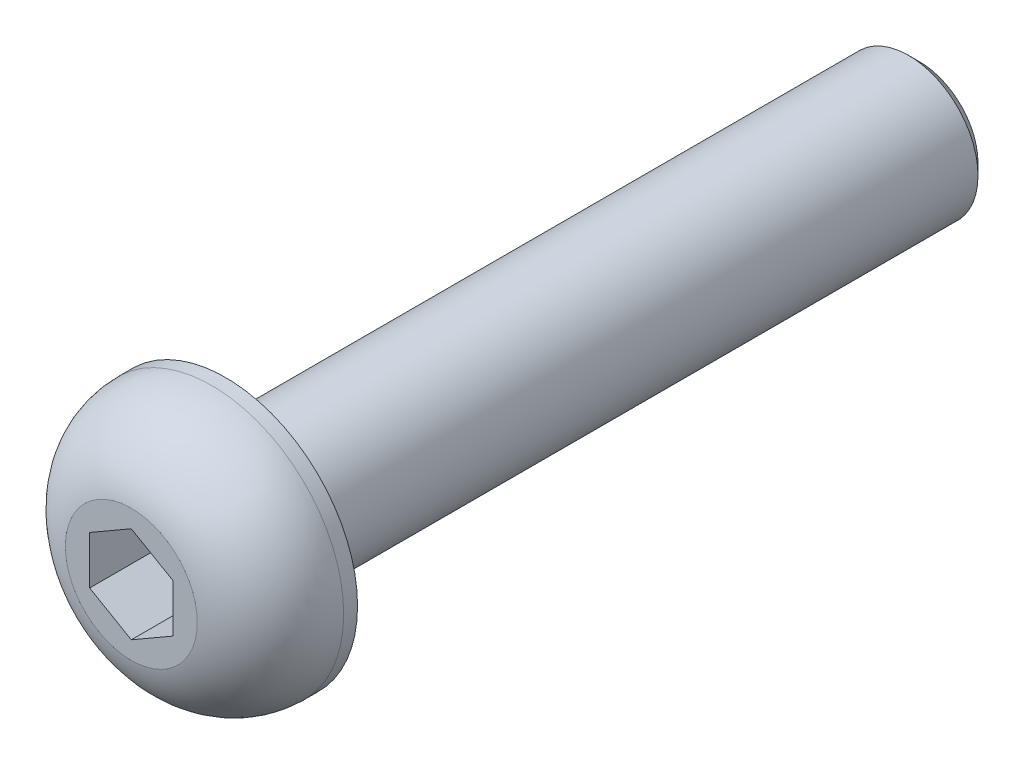
ISO-10303-21;
HEADER;
FILE_DESCRIPTION(('STEP AP214'),'2;1');
FILE_NAME('part.step','',(''),(''),'','','');
FILE_SCHEMA(('AUTOMOTIVE_DESIGN { 1 0 10303 214 1 1 1 1 }'));
ENDSEC;
DATA;
#1=APPLICATION_CONTEXT('core data for automotive mechanical design processes');
#2=APPLICATION_PROTOCOL_DEFINITION('international standard','automotive_design',2000,#1);
#3=PRODUCT_CONTEXT('',#1,'mechanical');
#4=PRODUCT('Part','Part','',(#3));
#5=PRODUCT_RELATED_PRODUCT_CATEGORY('part','',(#4));
#6=PRODUCT_DEFINITION_FORMATION('','',#4);
#7=PRODUCT_DEFINITION_CONTEXT('part definition',#1,'design');
#8=PRODUCT_DEFINITION('design','',#6,#7);
#9=PRODUCT_DEFINITION_SHAPE('','',#8);
#10=(LENGTH_UNIT() NAMED_UNIT(*) SI_UNIT(.MILLI.,.METRE.));
#11=(NAMED_UNIT(*) PLANE_ANGLE_UNIT() SI_UNIT($,.RADIAN.));
#12=(NAMED_UNIT(*) SI_UNIT($,.STERADIAN.) SOLID_ANGLE_UNIT());
#13=UNCERTAINTY_MEASURE_WITH_UNIT(LENGTH_MEASURE(1.E-05),#10,'distance_accuracy_value','');
#14=(GEOMETRIC_REPRESENTATION_CONTEXT(3) GLOBAL_UNCERTAINTY_ASSIGNED_CONTEXT((#13)) GLOBAL_UNIT_ASSIGNED_CONTEXT((#10,
#11,#12)) REPRESENTATION_CONTEXT('',''));
#15=CARTESIAN_POINT('',(0.,0.,0.));
#16=DIRECTION('',(0.,0.,1.));
#17=DIRECTION('',(1.,0.,0.));
#18=AXIS2_PLACEMENT_3D('',#15,#16,#17);
#19=CARTESIAN_POINT('',(0.,2.375,3.4));
#20=DIRECTION('',(0.,0.,-1.));
#21=DIRECTION('',(-1.,0.,0.));
#22=AXIS2_PLACEMENT_3D('',#19,#20,#21);
#23=PLANE('',#22);
#24=CARTESIAN_POINT('',(0.,0.,3.4));
#25=DIRECTION('',(0.,0.,1.));
#26=DIRECTION('',(1.,0.,0.));
#27=AXIS2_PLACEMENT_3D('',#24,#25,#26);
#28=CIRCLE('',#27,2.375);
#29=CARTESIAN_POINT('',(2.375,0.,3.4));
#30=VERTEX_POINT('',#29);
#31=EDGE_CURVE('E140',#30,#30,#28,.T.);
#32=ORIENTED_EDGE('',*,*,#31,.T.);
#33=EDGE_LOOP('',(#32));
#34=FACE_BOUND('',#33,.T.);
#35=DIRECTION('',(-0.866025403784439,-0.5,0.));
#36=VECTOR('',#35,1.);
#37=CARTESIAN_POINT('',(0.,1.73205080756888,3.4));
#38=LINE('',#37,#36);
#39=CARTESIAN_POINT('',(0.,1.73205080756888,3.4));
#40=VERTEX_POINT('',#39);
#41=CARTESIAN_POINT('',(-1.5,0.866025403784438,3.4));
#42=VERTEX_POINT('',#41);
#43=EDGE_CURVE('E92',#40,#42,#38,.T.);
#44=ORIENTED_EDGE('',*,*,#43,.F.);
#45=DIRECTION('',(-0.866025403784439,0.5,0.));
#46=VECTOR('',#45,1.);
#47=CARTESIAN_POINT('',(1.5,0.866025403784439,3.4));
#48=LINE('',#47,#46);
#49=CARTESIAN_POINT('',(1.5,0.866025403784439,3.4));
#50=VERTEX_POINT('',#49);
#51=EDGE_CURVE('E52',#50,#40,#48,.T.);
#52=ORIENTED_EDGE('',*,*,#51,.F.);
#53=DIRECTION('',(0.,1.,0.));
#54=VECTOR('',#53,1.);
#55=CARTESIAN_POINT('',(1.5,-0.866025403784438,3.4));
#56=LINE('',#55,#54);
#57=CARTESIAN_POINT('',(1.5,-0.866025403784438,3.4));
#58=VERTEX_POINT('',#57);
#59=EDGE_CURVE('E120',#58,#50,#56,.T.);
#60=ORIENTED_EDGE('',*,*,#59,.F.);
#61=DIRECTION('',(0.866025403784438,0.5,0.));
#62=VECTOR('',#61,1.);
#63=CARTESIAN_POINT('',(0.,-1.73205080756888,3.4));
#64=LINE('',#63,#62);
#65=CARTESIAN_POINT('',(0.,-1.73205080756888,3.4));
#66=VERTEX_POINT('',#65);
#67=EDGE_CURVE('E114',#66,#58,#64,.T.);
#68=ORIENTED_EDGE('',*,*,#67,.F.);
#69=DIRECTION('',(0.866025403784439,-0.5,0.));
#70=VECTOR('',#69,1.);
#71=CARTESIAN_POINT('',(-1.5,-0.866025403784438,3.4));
#72=LINE('',#71,#70);
#73=CARTESIAN_POINT('',(-1.5,-0.866025403784438,3.4));
#74=VERTEX_POINT('',#73);
#75=EDGE_CURVE('E112',#74,#66,#72,.T.);
#76=ORIENTED_EDGE('',*,*,#75,.F.);
#77=DIRECTION('',(0.,-1.,0.));
#78=VECTOR('',#77,1.);
#79=CARTESIAN_POINT('',(-1.5,0.866025403784438,3.4));
#80=LINE('',#79,#78);
#81=EDGE_CURVE('E100',#42,#74,#80,.T.);
#82=ORIENTED_EDGE('',*,*,#81,.F.);
#83=EDGE_LOOP('',(#44,#52,#60,#68,#76,#82));
#84=FACE_BOUND('',#83,.T.);
#85=ADVANCED_FACE('F37',(#34,#84),#23,.F.);
#86=CARTESIAN_POINT('',(0.,0.,-25.));
#87=DIRECTION('',(0.,0.,1.));
#88=DIRECTION('',(1.,0.,0.));
#89=AXIS2_PLACEMENT_3D('',#86,#87,#88);
#90=PLANE('',#89);
#91=CARTESIAN_POINT('',(0.,0.,-25.));
#92=DIRECTION('',(0.,0.,1.));
#93=DIRECTION('',(1.,0.,0.));
#94=AXIS2_PLACEMENT_3D('',#91,#92,#93);
#95=CIRCLE('',#94,2.09999999999999);
#96=CARTESIAN_POINT('',(2.09999999999999,0.,-25.));
#97=VERTEX_POINT('',#96);
#98=EDGE_CURVE('E231',#97,#97,#95,.F.);
#99=ORIENTED_EDGE('',*,*,#98,.T.);
#100=EDGE_LOOP('',(#99));
#101=FACE_BOUND('',#100,.T.);
#102=ADVANCED_FACE('F209',(#101),#90,.F.);
#103=CARTESIAN_POINT('',(0.,0.,30.8099697885196));
#104=DIRECTION('',(0.,0.,1.));
#105=DIRECTION('',(1.,0.,0.));
#106=AXIS2_PLACEMENT_3D('',#103,#104,#105);
#107=CYLINDRICAL_SURFACE('',#106,2.5);
#108=CARTESIAN_POINT('',(0.,0.,-0.199999999999999));
#109=DIRECTION('',(0.,0.,1.));
#110=DIRECTION('',(1.,0.,0.));
#111=AXIS2_PLACEMENT_3D('',#108,#109,#110);
#112=CIRCLE('',#111,2.5);
#113=CARTESIAN_POINT('',(2.5,0.,-0.199999999999999));
#114=VERTEX_POINT('',#113);
#115=EDGE_CURVE('E11',#114,#114,#112,.F.);
#116=ORIENTED_EDGE('',*,*,#115,.T.);
#117=EDGE_LOOP('',(#116));
#118=FACE_BOUND('',#117,.T.);
#119=CARTESIAN_POINT('',(0.,0.,-24.6));
#120=DIRECTION('',(0.,0.,1.));
#121=DIRECTION('',(1.,0.,0.));
#122=AXIS2_PLACEMENT_3D('',#119,#120,#121);
#123=CIRCLE('',#122,2.5);
#124=CARTESIAN_POINT('',(2.5,0.,-24.6));
#125=VERTEX_POINT('',#124);
#126=EDGE_CURVE('E226',#125,#125,#123,.T.);
#127=ORIENTED_EDGE('',*,*,#126,.T.);
#128=EDGE_LOOP('',(#127));
#129=FACE_BOUND('',#128,.T.);
#130=ADVANCED_FACE('F214',(#118,#129),#107,.T.);
#131=CARTESIAN_POINT('',(0.,2.5,0.));
#132=DIRECTION('',(0.,0.,1.));
#133=DIRECTION('',(1.,0.,0.));
#134=AXIS2_PLACEMENT_3D('',#131,#132,#133);
#135=PLANE('',#134);
#136=CARTESIAN_POINT('',(0.,0.,0.));
#137=DIRECTION('',(0.,0.,1.));
#138=DIRECTION('',(1.,0.,0.));
#139=AXIS2_PLACEMENT_3D('',#136,#137,#138);
#140=CIRCLE('',#139,2.7);
#141=CARTESIAN_POINT('',(2.7,0.,0.));
#142=VERTEX_POINT('',#141);
#143=EDGE_CURVE('E45',#142,#142,#140,.T.);
#144=ORIENTED_EDGE('',*,*,#143,.T.);
#145=EDGE_LOOP('',(#144));
#146=FACE_BOUND('',#145,.T.);
#147=CARTESIAN_POINT('',(0.,0.,0.));
#148=DIRECTION('',(0.,0.,1.));
#149=DIRECTION('',(1.,0.,0.));
#150=AXIS2_PLACEMENT_3D('',#147,#148,#149);
#151=CIRCLE('',#150,4.75);
#152=CARTESIAN_POINT('',(4.75,0.,0.));
#153=VERTEX_POINT('',#152);
#154=EDGE_CURVE('E222',#153,#153,#151,.T.);
#155=ORIENTED_EDGE('',*,*,#154,.F.);
#156=EDGE_LOOP('',(#155));
#157=FACE_BOUND('',#156,.T.);
#158=ADVANCED_FACE('F236',(#146,#157),#135,.F.);
#159=CARTESIAN_POINT('',(0.,0.,30.8099697885196));
#160=DIRECTION('',(0.,0.,1.));
#161=DIRECTION('',(1.,0.,0.));
#162=AXIS2_PLACEMENT_3D('',#159,#160,#161);
#163=CYLINDRICAL_SURFACE('',#162,4.75);
#164=CARTESIAN_POINT('',(0.,0.,0.5));
#165=DIRECTION('',(0.,0.,1.));
#166=DIRECTION('',(1.,0.,0.));
#167=AXIS2_PLACEMENT_3D('',#164,#165,#166);
#168=CIRCLE('',#167,4.75);
#169=CARTESIAN_POINT('',(4.75,0.,0.5));
#170=VERTEX_POINT('',#169);
#171=EDGE_CURVE('E220',#170,#170,#168,.T.);
#172=ORIENTED_EDGE('',*,*,#171,.F.);
#173=EDGE_LOOP('',(#172));
#174=FACE_BOUND('',#173,.T.);
#175=ORIENTED_EDGE('',*,*,#154,.T.);
#176=EDGE_LOOP('',(#175));
#177=FACE_BOUND('',#176,.T.);
#178=ADVANCED_FACE('F258',(#174,#177),#163,.T.);
#179=CARTESIAN_POINT('',(0.,0.,0.499999999999999));
#180=DIRECTION('',(0.,0.,1.));
#181=DIRECTION('',(1.,0.,0.));
#182=AXIS2_PLACEMENT_3D('',#179,#180,#181);
#183=DEGENERATE_TOROIDAL_SURFACE('',#182,1.79197368421052,2.95802631578948,.T.);
#184=ORIENTED_EDGE('',*,*,#31,.F.);
#185=EDGE_LOOP('',(#184));
#186=FACE_BOUND('',#185,.T.);
#187=ORIENTED_EDGE('',*,*,#171,.T.);
#188=EDGE_LOOP('',(#187));
#189=FACE_BOUND('',#188,.T.);
#190=ADVANCED_FACE('F252',(#186,#189),#183,.T.);
#191=CARTESIAN_POINT('',(0.,0.,-24.6));
#192=DIRECTION('',(0.,0.,1.));
#193=DIRECTION('',(1.,0.,0.));
#194=AXIS2_PLACEMENT_3D('',#191,#192,#193);
#195=CONICAL_SURFACE('',#194,2.5,0.785398163397445);
#196=ORIENTED_EDGE('',*,*,#98,.F.);
#197=EDGE_LOOP('',(#196));
#198=FACE_BOUND('',#197,.T.);
#199=ORIENTED_EDGE('',*,*,#126,.F.);
#200=EDGE_LOOP('',(#199));
#201=FACE_BOUND('',#200,.T.);
#202=ADVANCED_FACE('F250',(#198,#201),#195,.T.);
#203=CARTESIAN_POINT('',(1.5,0.866025403784439,-25.001));
#204=DIRECTION('',(0.5,0.866025403784439,0.));
#205=DIRECTION('',(-0.866025403784439,0.5,0.));
#206=AXIS2_PLACEMENT_3D('',#203,#204,#205);
#207=PLANE('',#206);
#208=CARTESIAN_POINT('',(-0.000199999999999678,1.73216627762271,1.13404126954845));
#209=CARTESIAN_POINT('',(0.0657192911025481,1.69410775715987,1.11205745276918));
#210=CARTESIAN_POINT('',(0.132207589122236,1.65572072040024,1.09206348568182));
#211=CARTESIAN_POINT('',(0.266335660665071,1.5782818421891,1.05716269718451));
#212=CARTESIAN_POINT('',(0.333977818646887,1.53922862406973,1.04226822432317));
#213=CARTESIAN_POINT('',(0.468423777869844,1.4616062133209,1.01908127731024));
#214=CARTESIAN_POINT('',(0.535206884927249,1.42304896848399,1.01063450771181));
#215=CARTESIAN_POINT('',(0.669087568389882,1.34575291984755,1.00054817351185));
#216=CARTESIAN_POINT('',(0.73618465770438,1.30701439726998,0.998900259357891));
#217=CARTESIAN_POINT('',(0.861574731829197,1.23462040422031,1.0023162190531));
#218=CARTESIAN_POINT('',(0.919886423219821,1.20095413349903,1.00654135522398));
#219=CARTESIAN_POINT('',(1.03612987953878,1.13384094270175,1.01993637143267));
#220=CARTESIAN_POINT('',(1.09406124196879,1.10039425500826,1.02911083361585));
#221=CARTESIAN_POINT('',(1.21054465133915,1.03314252725216,1.052047779955));
#222=CARTESIAN_POINT('',(1.26908194454669,0.999346005261151,1.06590755816145));
#223=CARTESIAN_POINT('',(1.38528312338636,0.932257223377917,1.09736438023666));
#224=CARTESIAN_POINT('',(1.44294849940381,0.898964103011321,1.11495402588962));
#225=CARTESIAN_POINT('',(1.5002,0.865909933730601,1.13404126954845));
#226=B_SPLINE_CURVE_WITH_KNOTS('',3,(#208,#209,#210,#211,#212,#213,#214,#215,#216,#217,#218,
#219,#220,#221,#222,#223,#224,#225),.UNSPECIFIED.,.F.,.F.,(4,2,2,2,2,2,2,2,4),(0.,
0.237777822177384,0.47612742284192,0.708577067230591,0.940741159251582,1.14294352835891,
1.34533342091876,1.55221450553907,1.75868901573748),.UNSPECIFIED.);
#227=CARTESIAN_POINT('',(0.,1.73205080756888,1.13397459621556));
#228=VERTEX_POINT('',#227);
#229=CARTESIAN_POINT('',(1.5,0.86602540378444,1.13397459621556));
#230=VERTEX_POINT('',#229);
#231=EDGE_CURVE('E141',#228,#230,#226,.T.);
#232=ORIENTED_EDGE('',*,*,#231,.T.);
#233=DIRECTION('',(0.,0.,1.));
#234=VECTOR('',#233,1.);
#235=CARTESIAN_POINT('',(1.5,0.866025403784439,-25.001));
#236=LINE('',#235,#234);
#237=EDGE_CURVE('E122',#230,#50,#236,.T.);
#238=ORIENTED_EDGE('',*,*,#237,.T.);
#239=ORIENTED_EDGE('',*,*,#51,.T.);
#240=DIRECTION('',(0.,0.,1.));
#241=VECTOR('',#240,1.);
#242=CARTESIAN_POINT('',(0.,1.73205080756888,-25.001));
#243=LINE('',#242,#241);
#244=EDGE_CURVE('E97',#228,#40,#243,.T.);
#245=ORIENTED_EDGE('',*,*,#244,.F.);
#246=EDGE_LOOP('',(#232,#238,#239,#245));
#247=FACE_BOUND('',#246,.T.);
#248=ADVANCED_FACE('F151',(#247),#207,.F.);
#249=CARTESIAN_POINT('',(1.5,-0.866025403784438,-25.001));
#250=DIRECTION('',(1.,0.,0.));
#251=DIRECTION('',(0.,1.,0.));
#252=AXIS2_PLACEMENT_3D('',#249,#250,#251);
#253=PLANE('',#252);
#254=CARTESIAN_POINT('',(1.5,-2.37874877868409,1.75759665323203));
#255=CARTESIAN_POINT('',(1.5,-2.31274574502044,1.72537160492485));
#256=CARTESIAN_POINT('',(1.5,-2.24659666013007,1.69344083131604));
#257=CARTESIAN_POINT('',(1.5,-2.11392884782338,1.63033245608343));
#258=CARTESIAN_POINT('',(1.5,-2.04741006838187,1.59915496394457));
#259=CARTESIAN_POINT('',(1.5,-1.91360751694505,1.53757215136867));
#260=CARTESIAN_POINT('',(1.5,-1.84632157835343,1.50717152292928));
#261=CARTESIAN_POINT('',(1.5,-1.71123224774828,1.44754705704895));
#262=CARTESIAN_POINT('',(1.5,-1.64342887898006,1.41832316710951));
#263=CARTESIAN_POINT('',(1.5,-1.50487114211733,1.36038888038743));
#264=CARTESIAN_POINT('',(1.5,-1.43409507585528,1.33173010789239));
#265=CARTESIAN_POINT('',(1.5,-1.2917483015657,1.27646281245522));
#266=CARTESIAN_POINT('',(1.5,-1.22017766117702,1.2498541165065));
#267=CARTESIAN_POINT('',(1.5,-1.07622501054223,1.19933823991993));
#268=CARTESIAN_POINT('',(1.5,-1.00384469305776,1.17542628177461));
#269=CARTESIAN_POINT('',(1.5,-0.858047452698781,1.13103890364063));
#270=CARTESIAN_POINT('',(1.5,-0.784630847150789,1.11056245537912));
#271=CARTESIAN_POINT('',(1.5,-0.637106765977147,1.0740972559044));
#272=CARTESIAN_POINT('',(1.5,-0.563005435987777,1.05808408778549));
#273=CARTESIAN_POINT('',(1.5,-0.413830143693647,1.03142192462866));
#274=CARTESIAN_POINT('',(1.5,-0.33875630129043,1.02077227465615));
#275=CARTESIAN_POINT('',(1.5,-0.189006040097561,1.00582523758463));
#276=CARTESIAN_POINT('',(1.5,-0.114338404690483,1.0014423232251));
#277=CARTESIAN_POINT('',(1.5,0.035097513669746,0.999161779875737));
#278=CARTESIAN_POINT('',(1.5,0.109865799731961,1.00126435603912));
#279=CARTESIAN_POINT('',(1.5,0.286095689598936,1.01368949202895));
#280=CARTESIAN_POINT('',(1.5,0.387367328373921,1.02672550290978));
#281=CARTESIAN_POINT('',(1.5,0.588195456312349,1.06255311121105));
#282=CARTESIAN_POINT('',(1.5,0.687750028982992,1.08535495747343));
#283=CARTESIAN_POINT('',(1.5,0.836816450941095,1.12531444011054));
#284=CARTESIAN_POINT('',(1.5,0.887073280800136,1.13980777431215));
#285=CARTESIAN_POINT('',(1.5,0.987067327855988,1.17039532179613));
#286=CARTESIAN_POINT('',(1.5,1.03680482900076,1.18648860351975));
#287=CARTESIAN_POINT('',(1.5,1.13582038517206,1.2200193186232));
#288=CARTESIAN_POINT('',(1.5,1.1850984463968,1.23745673384009));
#289=CARTESIAN_POINT('',(1.5,1.28324593886576,1.27346102756484));
#290=CARTESIAN_POINT('',(1.5,1.33211531537388,1.29202805469345));
#291=CARTESIAN_POINT('',(1.5,1.49440566438627,1.35547975652815));
#292=CARTESIAN_POINT('',(1.5,1.60701277223779,1.402445250974));
#293=CARTESIAN_POINT('',(1.5,1.83075302149775,1.49978016475535));
#294=CARTESIAN_POINT('',(1.5,1.94188581099527,1.55015037989139));
#295=CARTESIAN_POINT('',(1.5,2.16311574833764,1.65327366353819));
#296=CARTESIAN_POINT('',(1.5,2.27321224673675,1.70602811986459));
#297=CARTESIAN_POINT('',(1.5,2.49258510502557,1.81321950035594));
#298=CARTESIAN_POINT('',(1.5,2.60186142786115,1.86765649997343));
#299=CARTESIAN_POINT('',(1.5,2.92929969008695,2.03305140834138));
#300=CARTESIAN_POINT('',(1.5,3.14653602298829,2.14583782126264));
#301=CARTESIAN_POINT('',(1.5,3.57945631818397,2.37412943553697));
#302=CARTESIAN_POINT('',(1.5,3.79514084212188,2.48963358117076));
#303=CARTESIAN_POINT('',(1.5,4.19416669408602,2.70541439387798));
#304=CARTESIAN_POINT('',(1.5,4.37763617108744,2.80545434459614));
#305=CARTESIAN_POINT('',(1.5,4.74410282064929,3.00644416922784));
#306=CARTESIAN_POINT('',(1.5,4.92709993621561,3.10739414689505));
#307=CARTESIAN_POINT('',(1.5,5.29191078057049,3.30948937221621));
#308=CARTESIAN_POINT('',(1.5,5.47372612938883,3.41063169806351));
#309=CARTESIAN_POINT('',(1.5,5.83705821615903,3.61339728699118));
#310=CARTESIAN_POINT('',(1.5,6.01857498914784,3.71502048726914));
#311=CARTESIAN_POINT('',(1.5,6.19999510741632,3.81681495532188));
#312=B_SPLINE_CURVE_WITH_KNOTS('',3,(#254,#255,#256,#257,#258,#259,#260,#261,#262,#263,#264,
#265,#266,#267,#268,#269,#270,#271,#272,#273,#274,#275,#276,#277,#278,#279,#280,#281,#282,#283,
#284,#285,#286,#287,#288,#289,#290,#291,#292,#293,#294,#295,#296,#297,#298,#299,#300,#301,#302,
#303,#304,#305,#306,#307,#308,#309,#310,#311),.UNSPECIFIED.,.F.,.F.,(4,2,2,2,2,2,2,2,2,2,2,2,2,
2,2,2,2,2,2,2,2,2,2,2,2,2,2,2,4),(0.,0.220351468140766,0.44073477269315,0.662230491180661,
0.883716316980751,1.11276649608326,1.34179732435009,1.57041580992587,1.79896574579805,
2.02623966904286,2.25348583333163,2.47759997074845,2.70172119756067,3.00742120849379,
3.31344282815401,3.47033697782919,3.62714030606318,3.78394151582572,3.94076340040727,
4.30669011496381,4.67270265694945,5.03893106221478,5.4051759146467,6.13944337782784,
6.87343017182309,7.5003405818442,8.12732339442968,8.75148543497969,9.37556809355048),.UNSPECIFIED.);
#313=CARTESIAN_POINT('',(1.5,-0.866025403784438,1.13397459621556));
#314=VERTEX_POINT('',#313);
#315=EDGE_CURVE('E180',#230,#314,#312,.F.);
#316=ORIENTED_EDGE('',*,*,#315,.T.);
#317=DIRECTION('',(0.,0.,1.));
#318=VECTOR('',#317,1.);
#319=CARTESIAN_POINT('',(1.5,-0.866025403784438,-25.001));
#320=LINE('',#319,#318);
#321=EDGE_CURVE('E124',#314,#58,#320,.T.);
#322=ORIENTED_EDGE('',*,*,#321,.T.);
#323=ORIENTED_EDGE('',*,*,#59,.T.);
#324=ORIENTED_EDGE('',*,*,#237,.F.);
#325=EDGE_LOOP('',(#316,#322,#323,#324));
#326=FACE_BOUND('',#325,.T.);
#327=ADVANCED_FACE('F191',(#326),#253,.F.);
#328=CARTESIAN_POINT('',(0.,-1.73205080756888,-25.001));
#329=DIRECTION('',(0.5,-0.866025403784438,0.));
#330=DIRECTION('',(0.866025403784439,0.5,0.));
#331=AXIS2_PLACEMENT_3D('',#328,#329,#330);
#332=PLANE('',#331);
#333=CARTESIAN_POINT('',(1.5002,-0.8659099337306,1.13404126954845));
#334=CARTESIAN_POINT('',(1.43428070889745,-0.903968454193445,1.11205745276918));
#335=CARTESIAN_POINT('',(1.36779241087776,-0.942355490953072,1.09206348568182));
#336=CARTESIAN_POINT('',(1.23366433933493,-1.01979436916421,1.05716269718451));
#337=CARTESIAN_POINT('',(1.16602218135311,-1.05884758728358,1.04226822432317));
#338=CARTESIAN_POINT('',(1.03157622213016,-1.13646999803241,1.01908127731024));
#339=CARTESIAN_POINT('',(0.964793115072751,-1.17502724286933,1.01063450771181));
#340=CARTESIAN_POINT('',(0.830912431610118,-1.25232329150577,1.00054817351185));
#341=CARTESIAN_POINT('',(0.76381534229562,-1.29106181408333,0.998900259357891));
#342=CARTESIAN_POINT('',(0.638425268170803,-1.363455807133,1.0023162190531));
#343=CARTESIAN_POINT('',(0.580113576780179,-1.39712207785428,1.00654135522398));
#344=CARTESIAN_POINT('',(0.463870120461216,-1.46423526865157,1.01993637143267));
#345=CARTESIAN_POINT('',(0.405938758031214,-1.49768195634505,1.02911083361585));
#346=CARTESIAN_POINT('',(0.289455348660848,-1.56493368410116,1.052047779955));
#347=CARTESIAN_POINT('',(0.230918055453308,-1.59873020609216,1.06590755816145));
#348=CARTESIAN_POINT('',(0.11471687661364,-1.6658189879754,1.09736438023666));
#349=CARTESIAN_POINT('',(0.0570515005961901,-1.69911210834199,1.11495402588962));
#350=CARTESIAN_POINT('',(-0.000199999999999011,-1.73216627762271,1.13404126954845));
#351=B_SPLINE_CURVE_WITH_KNOTS('',3,(#333,#334,#335,#336,#337,#338,#339,#340,#341,#342,#343,
#344,#345,#346,#347,#348,#349,#350),.UNSPECIFIED.,.F.,.F.,(4,2,2,2,2,2,2,2,4),(0.,
0.237777822177384,0.47612742284192,0.708577067230591,0.940741159251582,1.14294352835891,
1.34533342091876,1.55221450553907,1.75868901573748),.UNSPECIFIED.);
#352=CARTESIAN_POINT('',(0.,-1.73205080756888,1.13397459621556));
#353=VERTEX_POINT('',#352);
#354=EDGE_CURVE('E173',#314,#353,#351,.T.);
#355=ORIENTED_EDGE('',*,*,#354,.T.);
#356=DIRECTION('',(0.,0.,1.));
#357=VECTOR('',#356,1.);
#358=CARTESIAN_POINT('',(0.,-1.73205080756888,-25.001));
#359=LINE('',#358,#357);
#360=EDGE_CURVE('E127',#353,#66,#359,.T.);
#361=ORIENTED_EDGE('',*,*,#360,.T.);
#362=ORIENTED_EDGE('',*,*,#67,.T.);
#363=ORIENTED_EDGE('',*,*,#321,.F.);
#364=EDGE_LOOP('',(#355,#361,#362,#363));
#365=FACE_BOUND('',#364,.T.);
#366=ADVANCED_FACE('F194',(#365),#332,.F.);
#367=CARTESIAN_POINT('',(-1.5,-0.866025403784438,-25.001));
#368=DIRECTION('',(-0.5,-0.866025403784439,0.));
#369=DIRECTION('',(0.866025403784439,-0.5,0.));
#370=AXIS2_PLACEMENT_3D('',#367,#368,#369);
#371=PLANE('',#370);
#372=CARTESIAN_POINT('',(0.000200000000000867,-1.73216627762271,1.13404126954845));
#373=CARTESIAN_POINT('',(-0.0657192911025468,-1.69410775715987,1.11205745276918));
#374=CARTESIAN_POINT('',(-0.132207589122234,-1.65572072040024,1.09206348568182));
#375=CARTESIAN_POINT('',(-0.26633566066507,-1.5782818421891,1.05716269718451));
#376=CARTESIAN_POINT('',(-0.333977818646886,-1.53922862406973,1.04226822432317));
#377=CARTESIAN_POINT('',(-0.468423777869843,-1.4616062133209,1.01908127731024));
#378=CARTESIAN_POINT('',(-0.535206884927247,-1.42304896848399,1.01063450771181));
#379=CARTESIAN_POINT('',(-0.66908756838988,-1.34575291984755,1.00054817351185));
#380=CARTESIAN_POINT('',(-0.736184657704379,-1.30701439726998,0.998900259357891));
#381=CARTESIAN_POINT('',(-0.861574731829196,-1.23462040422031,1.0023162190531));
#382=CARTESIAN_POINT('',(-0.91988642321982,-1.20095413349903,1.00654135522398));
#383=CARTESIAN_POINT('',(-1.03612987953878,-1.13384094270175,1.01993637143267));
#384=CARTESIAN_POINT('',(-1.09406124196879,-1.10039425500826,1.02911083361585));
#385=CARTESIAN_POINT('',(-1.21054465133915,-1.03314252725216,1.052047779955));
#386=CARTESIAN_POINT('',(-1.26908194454669,-0.99934600526115,1.06590755816145));
#387=CARTESIAN_POINT('',(-1.38528312338636,-0.932257223377916,1.09736438023666));
#388=CARTESIAN_POINT('',(-1.44294849940381,-0.89896410301132,1.11495402588962));
#389=CARTESIAN_POINT('',(-1.5002,-0.8659099337306,1.13404126954845));
#390=B_SPLINE_CURVE_WITH_KNOTS('',3,(#372,#373,#374,#375,#376,#377,#378,#379,#380,#381,#382,
#383,#384,#385,#386,#387,#388,#389),.UNSPECIFIED.,.F.,.F.,(4,2,2,2,2,2,2,2,4),(0.,
0.237777822177384,0.47612742284192,0.708577067230591,0.940741159251582,1.14294352835891,
1.34533342091876,1.55221450553907,1.75868901573748),.UNSPECIFIED.);
#391=CARTESIAN_POINT('',(-1.5,-0.866025403784476,1.13397459621554));
#392=VERTEX_POINT('',#391);
#393=EDGE_CURVE('E166',#353,#392,#390,.T.);
#394=ORIENTED_EDGE('',*,*,#393,.T.);
#395=DIRECTION('',(0.,0.,1.));
#396=VECTOR('',#395,1.);
#397=CARTESIAN_POINT('',(-1.5,-0.866025403784438,-25.001));
#398=LINE('',#397,#396);
#399=EDGE_CURVE('E108',#392,#74,#398,.T.);
#400=ORIENTED_EDGE('',*,*,#399,.T.);
#401=ORIENTED_EDGE('',*,*,#75,.T.);
#402=ORIENTED_EDGE('',*,*,#360,.F.);
#403=EDGE_LOOP('',(#394,#400,#401,#402));
#404=FACE_BOUND('',#403,.T.);
#405=ADVANCED_FACE('F198',(#404),#371,.F.);
#406=CARTESIAN_POINT('',(-1.5,0.866025403784438,-25.001));
#407=DIRECTION('',(-1.,0.,0.));
#408=DIRECTION('',(0.,0.,1.));
#409=AXIS2_PLACEMENT_3D('',#406,#407,#408);
#410=PLANE('',#409);
#411=CARTESIAN_POINT('',(-1.5,-2.37874877486364,1.75759665136626));
#412=CARTESIAN_POINT('',(-1.5,-2.31274574132915,1.72537160313687));
#413=CARTESIAN_POINT('',(-1.5,-2.24659665656804,1.69344082960579));
#414=CARTESIAN_POINT('',(-1.5,-2.11392884452025,1.63033245452826));
#415=CARTESIAN_POINT('',(-1.5,-2.04741006520838,1.59915496246675));
#416=CARTESIAN_POINT('',(-1.5,-1.91360751403276,1.53757215004554));
#417=CARTESIAN_POINT('',(-1.5,-1.84632157557268,1.5071715216835));
#418=CARTESIAN_POINT('',(-1.5,-1.71123224523151,1.44754705595659));
#419=CARTESIAN_POINT('',(-1.5,-1.64342887659572,1.41832316609321));
#420=CARTESIAN_POINT('',(-1.5,-1.50487114000789,1.36038887952544));
#421=CARTESIAN_POINT('',(-1.5,-1.43409507388839,1.33173010710848));
#422=CARTESIAN_POINT('',(-1.5,-1.2917482998861,1.27646281182335));
#423=CARTESIAN_POINT('',(-1.5,-1.22017765964215,1.2498541159486));
#424=CARTESIAN_POINT('',(-1.5,-1.07622500929951,1.19933823950309));
#425=CARTESIAN_POINT('',(-1.5,-1.00384469196246,1.17542628142486));
#426=CARTESIAN_POINT('',(-1.5,-0.85804745190227,1.13103890341441));
#427=CARTESIAN_POINT('',(-1.5,-0.784630846505657,1.11056245520934));
#428=CARTESIAN_POINT('',(-1.5,-0.637106765711287,1.07409725584894));
#429=CARTESIAN_POINT('',(-1.5,-0.563005435950861,1.05808408778374));
#430=CARTESIAN_POINT('',(-1.5,-0.413830144120324,1.03142192470009));
#431=CARTESIAN_POINT('',(-1.5,-0.338756301951752,1.02077227474707));
#432=CARTESIAN_POINT('',(-1.5,-0.189006041224555,1.0058252376726));
#433=CARTESIAN_POINT('',(-1.5,-0.11433840604845,1.0014423232914));
#434=CARTESIAN_POINT('',(-1.5,0.0350975118531223,0.999161779857832));
#435=CARTESIAN_POINT('',(-1.5,0.109865797687654,1.00126435595867));
#436=CARTESIAN_POINT('',(-1.5,0.286095687212982,1.01368949177416));
#437=CARTESIAN_POINT('',(-1.5,0.387367325875981,1.02672550255037));
#438=CARTESIAN_POINT('',(-1.5,0.588195453599218,1.06255311064005));
#439=CARTESIAN_POINT('',(-1.5,0.68775002616667,1.08535495679545));
#440=CARTESIAN_POINT('',(-1.5,0.836816447969716,1.12531443927462));
#441=CARTESIAN_POINT('',(-1.5,0.88707327777543,1.13980777342304));
#442=CARTESIAN_POINT('',(-1.5,0.987067324725341,1.17039532080236));
#443=CARTESIAN_POINT('',(-1.5,1.0368048258175,1.18648860247452));
#444=CARTESIAN_POINT('',(-1.5,1.13582038188398,1.22001931747695));
#445=CARTESIAN_POINT('',(-1.5,1.1850984430565,1.23745673264429));
#446=CARTESIAN_POINT('',(-1.5,1.28324593542101,1.27346102627171));
#447=CARTESIAN_POINT('',(-1.5,1.3321153118769,1.29202805335254));
#448=CARTESIAN_POINT('',(-1.5,1.49440566056735,1.35547975497309));
#449=CARTESIAN_POINT('',(-1.5,1.60701276815143,1.40244524924972));
#450=CARTESIAN_POINT('',(-1.5,1.83075301687818,1.49978016269251));
#451=CARTESIAN_POINT('',(-1.5,1.94188580610994,1.55015037765921));
#452=CARTESIAN_POINT('',(-1.5,2.16311574292137,1.65327366096842));
#453=CARTESIAN_POINT('',(-1.5,2.2732122410553,1.70602811712657));
#454=CARTESIAN_POINT('',(-1.5,2.49258509881367,1.81321949728282));
#455=CARTESIAN_POINT('',(-1.5,2.60186142138398,1.86765649673345));
#456=CARTESIAN_POINT('',(-1.5,2.92929968281435,2.03305140460314));
#457=CARTESIAN_POINT('',(-1.5,3.14653601518501,2.14583781719508));
#458=CARTESIAN_POINT('',(-1.5,3.57945630931752,2.37412943081493));
#459=CARTESIAN_POINT('',(-1.5,3.79514083272295,2.48963357612355));
#460=CARTESIAN_POINT('',(-1.5,4.19416668373965,2.70541438825285));
#461=CARTESIAN_POINT('',(-1.5,4.37763616032614,2.80545433871814));
#462=CARTESIAN_POINT('',(-1.5,4.74410280905717,3.0064441628461));
#463=CARTESIAN_POINT('',(-1.5,4.9270999242076,3.10739414026244));
#464=CARTESIAN_POINT('',(-1.5,5.29191076772769,3.30948936508216));
#465=CARTESIAN_POINT('',(-1.5,5.47372611612712,3.41063169067887));
#466=CARTESIAN_POINT('',(-1.5,5.8370582020589,3.61339727910642));
#467=CARTESIAN_POINT('',(-1.5,6.01857497462819,3.71502047913487));
#468=CARTESIAN_POINT('',(-1.5,6.19999509247694,3.81681494693849));
#469=B_SPLINE_CURVE_WITH_KNOTS('',3,(#411,#412,#413,#414,#415,#416,#417,#418,#419,#420,#421,
#422,#423,#424,#425,#426,#427,#428,#429,#430,#431,#432,#433,#434,#435,#436,#437,#438,#439,#440,
#441,#442,#443,#444,#445,#446,#447,#448,#449,#450,#451,#452,#453,#454,#455,#456,#457,#458,#459,
#460,#461,#462,#463,#464,#465,#466,#467,#468),.UNSPECIFIED.,.F.,.F.,(4,2,2,2,2,2,2,2,2,2,2,2,2,
2,2,2,2,2,2,2,2,2,2,2,2,2,2,2,4),(0.,0.220351467690176,0.440734771791907,0.66223048982423,
0.883716315169167,1.1127664937874,1.34179732157003,1.57041580666299,1.79896574205271,
2.02623966459362,2.25348582817953,2.47759996491114,2.70172119103782,3.0074212015981,
3.31344282088424,3.4703369703614,3.62714029839762,3.78394150796283,3.94076339234695,
4.30669010596745,4.67270264701708,5.0389310513468,5.40517590284316,6.13944336415589,
6.87343015628234,7.50034056484735,8.12732337597685,8.75148541506317,9.37556807217012),.UNSPECIFIED.);
#470=CARTESIAN_POINT('',(-1.5,0.866025403784438,1.13397459621557));
#471=VERTEX_POINT('',#470);
#472=EDGE_CURVE('E107',#392,#471,#469,.T.);
#473=ORIENTED_EDGE('',*,*,#472,.T.);
#474=DIRECTION('',(0.,0.,1.));
#475=VECTOR('',#474,1.);
#476=CARTESIAN_POINT('',(-1.5,0.866025403784438,-25.001));
#477=LINE('',#476,#475);
#478=EDGE_CURVE('E96',#471,#42,#477,.T.);
#479=ORIENTED_EDGE('',*,*,#478,.T.);
#480=ORIENTED_EDGE('',*,*,#81,.T.);
#481=ORIENTED_EDGE('',*,*,#399,.F.);
#482=EDGE_LOOP('',(#473,#479,#480,#481));
#483=FACE_BOUND('',#482,.T.);
#484=ADVANCED_FACE('F104',(#483),#410,.F.);
#485=CARTESIAN_POINT('',(0.,1.73205080756888,-25.001));
#486=DIRECTION('',(-0.5,0.866025403784439,0.));
#487=DIRECTION('',(-0.866025403784439,-0.5,0.));
#488=AXIS2_PLACEMENT_3D('',#485,#486,#487);
#489=PLANE('',#488);
#490=CARTESIAN_POINT('',(-1.5002,0.8659099337306,1.13404126954845));
#491=CARTESIAN_POINT('',(-1.43428070889745,0.903968454193445,1.11205745276918));
#492=CARTESIAN_POINT('',(-1.36779241087776,0.942355490953071,1.09206348568182));
#493=CARTESIAN_POINT('',(-1.23366433933493,1.01979436916421,1.05716269718451));
#494=CARTESIAN_POINT('',(-1.16602218135311,1.05884758728358,1.04226822432317));
#495=CARTESIAN_POINT('',(-1.03157622213016,1.13646999803241,1.01908127731024));
#496=CARTESIAN_POINT('',(-0.964793115072751,1.17502724286933,1.01063450771181));
#497=CARTESIAN_POINT('',(-0.830912431610119,1.25232329150577,1.00054817351185));
#498=CARTESIAN_POINT('',(-0.763815342295621,1.29106181408333,0.998900259357891));
#499=CARTESIAN_POINT('',(-0.638425268170804,1.363455807133,1.0023162190531));
#500=CARTESIAN_POINT('',(-0.58011357678018,1.39712207785428,1.00654135522398));
#501=CARTESIAN_POINT('',(-0.463870120461216,1.46423526865157,1.01993637143267));
#502=CARTESIAN_POINT('',(-0.405938758031213,1.49768195634505,1.02911083361585));
#503=CARTESIAN_POINT('',(-0.289455348660847,1.56493368410116,1.052047779955));
#504=CARTESIAN_POINT('',(-0.230918055453308,1.59873020609216,1.06590755816145));
#505=CARTESIAN_POINT('',(-0.11471687661364,1.6658189879754,1.09736438023666));
#506=CARTESIAN_POINT('',(-0.0570515005961892,1.69911210834199,1.11495402588962));
#507=CARTESIAN_POINT('',(0.000200000000000274,1.73216627762271,1.13404126954845));
#508=B_SPLINE_CURVE_WITH_KNOTS('',3,(#490,#491,#492,#493,#494,#495,#496,#497,#498,#499,#500,
#501,#502,#503,#504,#505,#506,#507),.UNSPECIFIED.,.F.,.F.,(4,2,2,2,2,2,2,2,4),(0.,
0.237777822177384,0.47612742284192,0.708577067230591,0.940741159251582,1.14294352835891,
1.34533342091876,1.55221450553907,1.75868901573748),.UNSPECIFIED.);
#509=EDGE_CURVE('E132',#471,#228,#508,.T.);
#510=ORIENTED_EDGE('',*,*,#509,.T.);
#511=ORIENTED_EDGE('',*,*,#244,.T.);
#512=ORIENTED_EDGE('',*,*,#43,.T.);
#513=ORIENTED_EDGE('',*,*,#478,.F.);
#514=EDGE_LOOP('',(#510,#511,#512,#513));
#515=FACE_BOUND('',#514,.T.);
#516=ADVANCED_FACE('F95',(#515),#489,.F.);
#517=CARTESIAN_POINT('',(0.,0.,0.133974596215552));
#518=DIRECTION('',(0.,0.,1.));
#519=DIRECTION('',(1.,0.,0.));
#520=AXIS2_PLACEMENT_3D('',#517,#518,#519);
#521=CONICAL_SURFACE('',#520,0.,1.04719755119659);
#522=ORIENTED_EDGE('',*,*,#354,.F.);
#523=ORIENTED_EDGE('',*,*,#315,.F.);
#524=ORIENTED_EDGE('',*,*,#231,.F.);
#525=ORIENTED_EDGE('',*,*,#509,.F.);
#526=ORIENTED_EDGE('',*,*,#472,.F.);
#527=ORIENTED_EDGE('',*,*,#393,.F.);
#528=EDGE_LOOP('',(#522,#523,#524,#525,#526,#527));
#529=FACE_BOUND('',#528,.T.);
#530=CARTESIAN_POINT('',(0.,0.,0.133974596215552));
#531=VERTEX_POINT('',#530);
#532=VERTEX_LOOP('',#531);
#533=FACE_BOUND('',#532,.T.);
#534=ADVANCED_FACE('F146',(#529,#533),#521,.F.);
#535=CARTESIAN_POINT('',(0.,0.,-0.199999999999999));
#536=DIRECTION('',(0.,0.,1.));
#537=DIRECTION('',(1.,0.,0.));
#538=AXIS2_PLACEMENT_3D('',#535,#536,#537);
#539=TOROIDAL_SURFACE('',#538,2.7,0.2);
#540=ORIENTED_EDGE('',*,*,#115,.F.);
#541=EDGE_LOOP('',(#540));
#542=FACE_BOUND('',#541,.T.);
#543=ORIENTED_EDGE('',*,*,#143,.F.);
#544=EDGE_LOOP('',(#543));
#545=FACE_BOUND('',#544,.T.);
#546=ADVANCED_FACE('F39',(#542,#545),#539,.F.);
#547=CLOSED_SHELL('',(#85,#102,#130,#158,#178,#190,#202,#248,#327,#366,#405,#484,#516,#534,#546));
#548=MANIFOLD_SOLID_BREP('B2',#547);
#549=ADVANCED_BREP_SHAPE_REPRESENTATION('',(#18,#548),#14);
#550=SHAPE_DEFINITION_REPRESENTATION(#9,#549);
ENDSEC;
END-ISO-10303-21;
